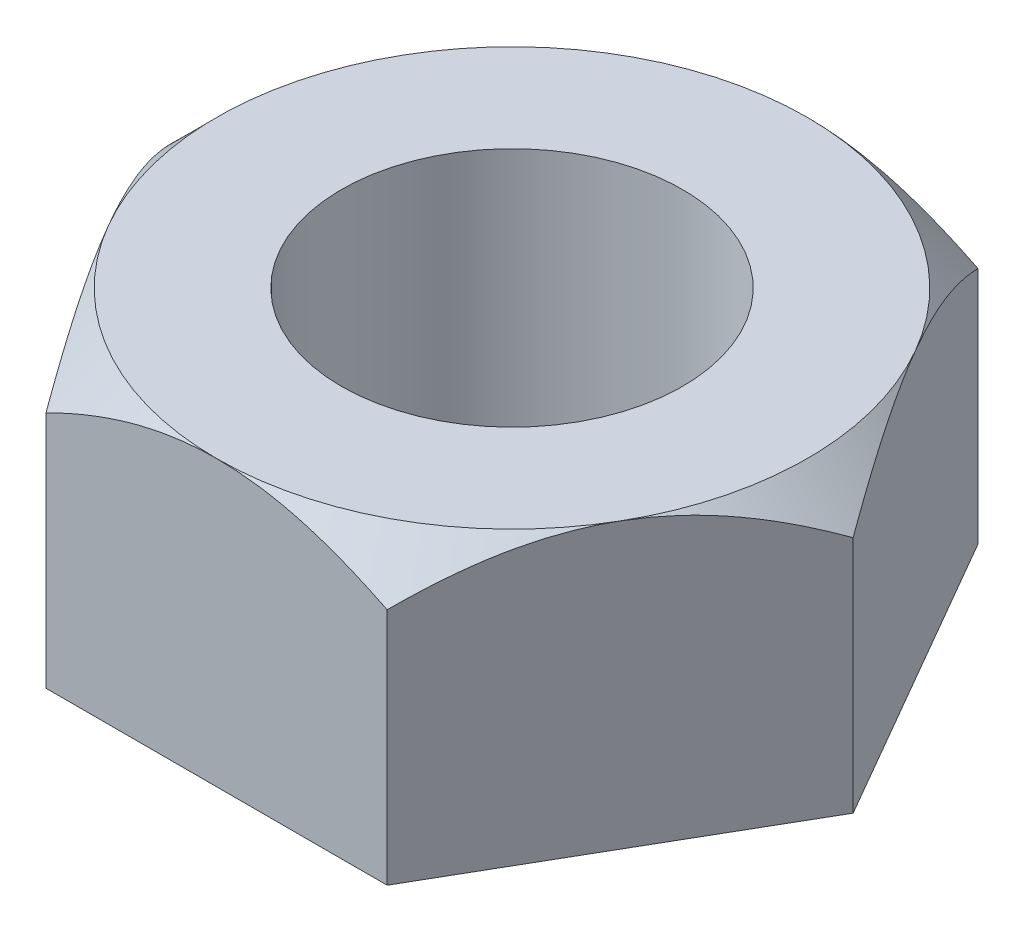
ISO-10303-21;
HEADER;
FILE_DESCRIPTION(('STEP AP214'),'2;1');
FILE_NAME('part.step','',(''),(''),'','','');
FILE_SCHEMA(('AUTOMOTIVE_DESIGN { 1 0 10303 214 1 1 1 1 }'));
ENDSEC;
DATA;
#1=APPLICATION_CONTEXT('core data for automotive mechanical design processes');
#2=APPLICATION_PROTOCOL_DEFINITION('international standard','automotive_design',2000,#1);
#3=PRODUCT_CONTEXT('',#1,'mechanical');
#4=PRODUCT('Part','Part','',(#3));
#5=PRODUCT_RELATED_PRODUCT_CATEGORY('part','',(#4));
#6=PRODUCT_DEFINITION_FORMATION('','',#4);
#7=PRODUCT_DEFINITION_CONTEXT('part definition',#1,'design');
#8=PRODUCT_DEFINITION('design','',#6,#7);
#9=PRODUCT_DEFINITION_SHAPE('','',#8);
#10=(LENGTH_UNIT() NAMED_UNIT(*) SI_UNIT(.MILLI.,.METRE.));
#11=(NAMED_UNIT(*) PLANE_ANGLE_UNIT() SI_UNIT($,.RADIAN.));
#12=(NAMED_UNIT(*) SI_UNIT($,.STERADIAN.) SOLID_ANGLE_UNIT());
#13=UNCERTAINTY_MEASURE_WITH_UNIT(LENGTH_MEASURE(1.E-05),#10,'distance_accuracy_value','');
#14=(GEOMETRIC_REPRESENTATION_CONTEXT(3) GLOBAL_UNCERTAINTY_ASSIGNED_CONTEXT((#13)) GLOBAL_UNIT_ASSIGNED_CONTEXT((#10,
#11,#12)) REPRESENTATION_CONTEXT('',''));
#15=CARTESIAN_POINT('',(0.,0.,0.));
#16=DIRECTION('',(0.,0.,1.));
#17=DIRECTION('',(1.,0.,0.));
#18=AXIS2_PLACEMENT_3D('',#15,#16,#17);
#19=CARTESIAN_POINT('',(-6.,10.,10.3923048454133));
#20=DIRECTION('',(0.,0.,-1.));
#21=DIRECTION('',(-1.,0.,0.));
#22=AXIS2_PLACEMENT_3D('',#19,#20,#21);
#23=PLANE('',#22);
#24=CARTESIAN_POINT('',(-21.6206993518133,-3.596330806943,10.3923048454133));
#25=CARTESIAN_POINT('',(-21.3055514126179,-3.3122960604371,10.3923048454133));
#26=CARTESIAN_POINT('',(-20.9898299589717,-3.02889886599414,10.3923048454133));
#27=CARTESIAN_POINT('',(-20.3570839472921,-2.46356232683649,10.3923048454133));
#28=CARTESIAN_POINT('',(-20.0400593873951,-2.18162298420794,10.3923048454133));
#29=CARTESIAN_POINT('',(-19.0866059232702,-1.33809688267694,10.3923048454133));
#30=CARTESIAN_POINT('',(-18.4479878344888,-0.778974225031821,10.3923048454133));
#31=CARTESIAN_POINT('',(-17.4811694968122,0.0560144141050043,10.3923048454133));
#32=CARTESIAN_POINT('',(-17.155762278147,0.335116547171424,10.3923048454133));
#33=CARTESIAN_POINT('',(-16.5027541968676,0.890730128355099,10.3923048454133));
#34=CARTESIAN_POINT('',(-16.1751533854532,1.16724163658034,10.3923048454133));
#35=CARTESIAN_POINT('',(-15.5174864907664,1.71719097919003,10.3923048454133));
#36=CARTESIAN_POINT('',(-15.187420891801,1.99062939226446,10.3923048454133));
#37=CARTESIAN_POINT('',(-14.5243374489299,2.53396673416056,10.3923048454133));
#38=CARTESIAN_POINT('',(-14.1913193517913,2.80386535435777,10.3923048454133));
#39=CARTESIAN_POINT('',(-13.5542248987635,3.31354301426288,10.3923048454133));
#40=CARTESIAN_POINT('',(-13.2504611992028,3.55371250124612,10.3923048454133));
#41=CARTESIAN_POINT('',(-12.6397408542536,4.02995499860667,10.3923048454133));
#42=CARTESIAN_POINT('',(-12.3327842505221,4.26602806232206,10.3923048454133));
#43=CARTESIAN_POINT('',(-11.7152096179151,4.73327041249862,10.3923048454133));
#44=CARTESIAN_POINT('',(-11.4045920105797,4.9644402551152,10.3923048454133));
#45=CARTESIAN_POINT('',(-10.77907899405,5.42090531236507,10.3923048454133));
#46=CARTESIAN_POINT('',(-10.4641837555985,5.64620076043456,10.3923048454133));
#47=CARTESIAN_POINT('',(-9.83007578699629,6.08919258607606,10.3923048454133));
#48=CARTESIAN_POINT('',(-9.51087368019942,6.30690412570485,10.3923048454133));
#49=CARTESIAN_POINT('',(-8.86666135316096,6.73362882974555,10.3923048454133));
#50=CARTESIAN_POINT('',(-8.54165082085976,6.9426415247888,10.3923048454133));
#51=CARTESIAN_POINT('',(-7.88515221894587,7.34970782275022,10.3923048454133));
#52=CARTESIAN_POINT('',(-7.55366935481359,7.54776977846495,10.3923048454133));
#53=CARTESIAN_POINT('',(-6.88301435919936,7.93036175659987,10.3923048454133));
#54=CARTESIAN_POINT('',(-6.54384352998889,8.114894048726,10.3923048454133));
#55=CARTESIAN_POINT('',(-5.87757356544897,8.45626320037056,10.3923048454133));
#56=CARTESIAN_POINT('',(-5.55099295818714,8.61410155703159,10.3923048454133));
#57=CARTESIAN_POINT('',(-5.05483096651693,8.83680767212428,10.3923048454133));
#58=CARTESIAN_POINT('',(-4.88839449632592,8.90870138002609,10.3923048454133));
#59=CARTESIAN_POINT('',(-4.55330416372106,9.04729307515487,10.3923048454133));
#60=CARTESIAN_POINT('',(-4.38464952088745,9.11398917327526,10.3923048454133));
#61=CARTESIAN_POINT('',(-3.87627471703024,9.3050580690559,10.3923048454133));
#62=CARTESIAN_POINT('',(-3.53324315311512,9.42082191235406,10.3923048454133));
#63=CARTESIAN_POINT('',(-2.83901608514014,9.62429174950344,10.3923048454133));
#64=CARTESIAN_POINT('',(-2.48782466676752,9.712011473751,10.3923048454133));
#65=CARTESIAN_POINT('',(-1.83410167957487,9.84346469092425,10.3923048454133));
#66=CARTESIAN_POINT('',(-1.532527448349,9.89192574685305,10.3923048454133));
#67=CARTESIAN_POINT('',(-0.92635308742365,9.96313322104827,10.3923048454133));
#68=CARTESIAN_POINT('',(-0.62175342865318,9.98588357999496,10.3923048454133));
#69=CARTESIAN_POINT('',(-0.0120669556095173,10.0044545916522,10.3923048454133));
#70=CARTESIAN_POINT('',(0.293018909048942,10.000305878249,10.3923048454133));
#71=CARTESIAN_POINT('',(0.901668344868203,9.96538747166634,10.3923048454133));
#72=CARTESIAN_POINT('',(1.20523169297935,9.93461398627781,10.3923048454133));
#73=CARTESIAN_POINT('',(1.88652949323463,9.83683042574832,10.3923048454133));
#74=CARTESIAN_POINT('',(2.26321906330949,9.76252598791442,10.3923048454133));
#75=CARTESIAN_POINT('',(3.00808460636821,9.57944762224546,10.3923048454133));
#76=CARTESIAN_POINT('',(3.37625684553137,9.47065887332788,10.3923048454133));
#77=CARTESIAN_POINT('',(4.10474857763028,9.22401107197817,10.3923048454133));
#78=CARTESIAN_POINT('',(4.46501735067411,9.08600396250787,10.3923048454133));
#79=CARTESIAN_POINT('',(4.9979788556195,8.86174352448241,10.3923048454133));
#80=CARTESIAN_POINT('',(5.17438587361458,8.78411834986138,10.3923048454133));
#81=CARTESIAN_POINT('',(5.52484590698173,8.6237173827543,10.3923048454133));
#82=CARTESIAN_POINT('',(5.69889893597159,8.54094162007983,10.3923048454133));
#83=CARTESIAN_POINT('',(6.15121807751195,8.31843775144226,10.3923048454133));
#84=CARTESIAN_POINT('',(6.42767062753615,8.17502179315701,10.3923048454133));
#85=CARTESIAN_POINT('',(6.97522748516027,7.87827823116683,10.3923048454133));
#86=CARTESIAN_POINT('',(7.24633088988748,7.7249489725796,10.3923048454133));
#87=CARTESIAN_POINT('',(7.78387778962265,7.40995949321741,10.3923048454133));
#88=CARTESIAN_POINT('',(8.05031810084943,7.24829385675954,10.3923048454133));
#89=CARTESIAN_POINT('',(8.57887190669922,6.91808974168155,10.3923048454133));
#90=CARTESIAN_POINT('',(8.84098562287998,6.74955161653359,10.3923048454133));
#91=CARTESIAN_POINT('',(9.36204762535117,6.40626115586318,10.3923048454133));
#92=CARTESIAN_POINT('',(9.62098630485496,6.23149427224553,10.3923048454133));
#93=CARTESIAN_POINT('',(10.1354737518374,5.87703280649236,10.3923048454133));
#94=CARTESIAN_POINT('',(10.3910223941222,5.69733804311815,10.3923048454133));
#95=CARTESIAN_POINT('',(11.1530005881035,5.15212391316027,10.3923048454133));
#96=CARTESIAN_POINT('',(11.6549546595064,4.7803464788793,10.3923048454133));
#97=CARTESIAN_POINT('',(12.6516719131614,4.02282960092673,10.3923048454133));
#98=CARTESIAN_POINT('',(13.146393216593,3.63703544381726,10.3923048454133));
#99=CARTESIAN_POINT('',(14.1283558734258,2.8560018432547,10.3923048454133));
#100=CARTESIAN_POINT('',(14.6155967522649,2.46076180458316,10.3923048454133));
#101=CARTESIAN_POINT('',(15.5834024343999,1.66352121613933,10.3923048454133));
#102=CARTESIAN_POINT('',(16.0639753221122,1.26153045461263,10.3923048454133));
#103=CARTESIAN_POINT('',(17.0202286237539,0.451803972584521,10.3923048454133));
#104=CARTESIAN_POINT('',(17.4959091504046,0.0440683849607594,10.3923048454133));
#105=CARTESIAN_POINT('',(18.5857834106937,-0.899383889295671,10.3923048454133));
#106=CARTESIAN_POINT('',(19.1985933109595,-1.43669817946351,10.3923048454133));
#107=CARTESIAN_POINT('',(20.1119913713059,-2.24555025523196,10.3923048454133));
#108=CARTESIAN_POINT('',(20.4145843309025,-2.51483159840266,10.3923048454133));
#109=CARTESIAN_POINT('',(21.0185255042956,-3.05465875172758,10.3923048454133));
#110=CARTESIAN_POINT('',(21.3198739674337,-3.32520428287831,10.3923048454133));
#111=CARTESIAN_POINT('',(21.6206993518133,-3.596330806943,10.3923048454133));
#112=B_SPLINE_CURVE_WITH_KNOTS('',3,(#24,#25,#26,#27,#28,#29,#30,#31,#32,#33,#34,#35,#36,#37,
#38,#39,#40,#41,#42,#43,#44,#45,#46,#47,#48,#49,#50,#51,#52,#53,#54,#55,#56,#57,#58,#59,#60,#61,
#62,#63,#64,#65,#66,#67,#68,#69,#70,#71,#72,#73,#74,#75,#76,#77,#78,#79,#80,#81,#82,#83,#84,#85,
#86,#87,#88,#89,#90,#91,#92,#93,#94,#95,#96,#97,#98,#99,#100,#101,#102,#103,#104,#105,#106,#107,
#108,#109,#110,#111),.UNSPECIFIED.,.F.,.F.,(4,2,2,2,2,2,2,2,2,2,2,2,2,2,2,2,2,2,2,2,2,2,2,2,2,2,
2,2,2,2,2,2,2,2,2,2,2,2,2,2,2,2,2,4),(0.,1.27276775466827,2.54553733011866,5.09184700659243,
6.37795130686239,7.66402569251973,8.94985369884594,10.2357930774019,11.3974798330945,
12.5591514515108,13.7206905931806,14.8821835071429,16.0412027596678,17.2002844692094,
18.3584695209899,19.5164598315717,20.604096177326,21.1479183662783,21.6919372980782,
22.7770118849817,23.8615544030578,24.7768783846365,25.6920620554116,26.6062036566352,
27.5204754819565,28.6703479249883,29.8207152456636,30.9770576048754,31.5551849882646,
32.1333090257656,33.0673651644254,34.0015776348918,34.9364048511609,35.8711840470332,
36.8083116692343,37.745473803676,39.6191051770633,41.5010644716399,43.3831426694556,
45.2626941975387,47.1422023227891,49.5871775634721,50.8023598643285,52.0172855745421),.UNSPECIFIED.);
#113=CARTESIAN_POINT('',(-6.,8.39230484541327,10.3923048454133));
#114=VERTEX_POINT('',#113);
#115=CARTESIAN_POINT('',(0.,10.,10.3923048454133));
#116=VERTEX_POINT('',#115);
#117=EDGE_CURVE('E209',#114,#116,#112,.T.);
#118=ORIENTED_EDGE('',*,*,#117,.F.);
#119=DIRECTION('',(0.,-1.,0.));
#120=VECTOR('',#119,1.);
#121=CARTESIAN_POINT('',(-6.,10.,10.3923048454133));
#122=LINE('',#121,#120);
#123=CARTESIAN_POINT('',(-6.,0.,10.3923048454133));
#124=VERTEX_POINT('',#123);
#125=EDGE_CURVE('E212',#114,#124,#122,.T.);
#126=ORIENTED_EDGE('',*,*,#125,.T.);
#127=DIRECTION('',(1.,0.,0.));
#128=VECTOR('',#127,1.);
#129=CARTESIAN_POINT('',(-6.,0.,10.3923048454133));
#130=LINE('',#129,#128);
#131=CARTESIAN_POINT('',(6.,0.,10.3923048454133));
#132=VERTEX_POINT('',#131);
#133=EDGE_CURVE('E214',#124,#132,#130,.T.);
#134=ORIENTED_EDGE('',*,*,#133,.T.);
#135=DIRECTION('',(0.,-1.,0.));
#136=VECTOR('',#135,1.);
#137=CARTESIAN_POINT('',(6.,10.,10.3923048454133));
#138=LINE('',#137,#136);
#139=CARTESIAN_POINT('',(6.,8.39230484541327,10.3923048454133));
#140=VERTEX_POINT('',#139);
#141=EDGE_CURVE('E233',#140,#132,#138,.T.);
#142=ORIENTED_EDGE('',*,*,#141,.F.);
#143=EDGE_CURVE('E114',#116,#140,#112,.T.);
#144=ORIENTED_EDGE('',*,*,#143,.F.);
#145=EDGE_LOOP('',(#118,#126,#134,#142,#144));
#146=FACE_BOUND('',#145,.T.);
#147=ADVANCED_FACE('F38',(#146),#23,.F.);
#148=CARTESIAN_POINT('',(6.,10.,10.3923048454133));
#149=DIRECTION('',(-0.866025403784439,0.,-0.5));
#150=DIRECTION('',(-0.5,0.,0.866025403784439));
#151=AXIS2_PLACEMENT_3D('',#148,#149,#150);
#152=PLANE('',#151);
#153=CARTESIAN_POINT('',(5.99988452994617,8.39218937369278,10.3925048454133));
#154=CARTESIAN_POINT('',(6.1030381594071,8.4953281696419,10.2138375182018));
#155=CARTESIAN_POINT('',(6.20699964746772,8.59531973140851,10.0337709388503));
#156=CARTESIAN_POINT('',(6.41666408996548,8.7880086633455,9.6706214719036));
#157=CARTESIAN_POINT('',(6.52236795790391,8.88070204993272,9.4875370020777));
#158=CARTESIAN_POINT('',(6.73614147656208,9.05818746620379,9.11727040644898));
#159=CARTESIAN_POINT('',(6.84422120771261,9.14293121606065,8.93007082082787));
#160=CARTESIAN_POINT('',(7.06215583727054,9.30267680526308,8.55259696970483));
#161=CARTESIAN_POINT('',(7.17201046138372,9.37768013401625,8.36232317929443));
#162=CARTESIAN_POINT('',(7.39172859565888,9.5155717685406,7.98176020738561));
#163=CARTESIAN_POINT('',(7.50156510516717,9.57863117888927,7.79151779239123));
#164=CARTESIAN_POINT('',(7.72277783197739,9.69279444914292,7.40836611027507));
#165=CARTESIAN_POINT('',(7.8341538821485,9.74389959616047,7.21545713263237));
#166=CARTESIAN_POINT('',(8.05796930351608,9.83286771805832,6.82779745130629));
#167=CARTESIAN_POINT('',(8.17040568583668,9.87076049950764,6.63305192450777));
#168=CARTESIAN_POINT('',(8.39622238331246,9.93247124852732,6.24192593128229));
#169=CARTESIAN_POINT('',(8.50960255484698,9.95629131928772,6.04554571361363));
#170=CARTESIAN_POINT('',(8.78590060608536,9.99623087577283,5.56698345083649));
#171=CARTESIAN_POINT('',(8.94911712583534,10.0046121370882,5.28428414599495));
#172=CARTESIAN_POINT('',(9.27525497510895,9.99054418700371,4.71939682078182));
#173=CARTESIAN_POINT('',(9.43817618112011,9.96808416871151,4.4372090143401));
#174=CARTESIAN_POINT('',(9.76248281098389,9.89365937516114,3.8754934541846));
#175=CARTESIAN_POINT('',(9.92386631200424,9.84166160773261,3.59596903091401));
#176=CARTESIAN_POINT('',(10.2438594395474,9.71098774624142,3.0417246759364));
#177=CARTESIAN_POINT('',(10.4024692778025,9.63231369798948,2.76700437749825));
#178=CARTESIAN_POINT('',(10.68402227325,9.47046186580933,2.27934028436002));
#179=CARTESIAN_POINT('',(10.8075890248271,9.39154171858198,2.0653163925023));
#180=CARTESIAN_POINT('',(11.0525044969076,9.22098444399686,1.6411103512991));
#181=CARTESIAN_POINT('',(11.1738531501813,9.12934693190126,1.43092831839898));
#182=CARTESIAN_POINT('',(11.4139502096801,8.93540891686254,1.01506801259922));
#183=CARTESIAN_POINT('',(11.5327054442283,8.83314194803767,0.809377912696873));
#184=CARTESIAN_POINT('',(11.7680170433821,8.61928749062455,0.401806267352167));
#185=CARTESIAN_POINT('',(11.8845747031439,8.50770571656851,0.199922478633452));
#186=CARTESIAN_POINT('',(12.0001154700538,8.39218937369278,-0.000200000000000385));
#187=B_SPLINE_CURVE_WITH_KNOTS('',3,(#153,#154,#155,#156,#157,#158,#159,#160,#161,#162,#163,
#164,#165,#166,#167,#168,#169,#170,#171,#172,#173,#174,#175,#176,#177,#178,#179,#180,#181,#182,
#183,#184,#185,#186),.UNSPECIFIED.,.F.,.F.,(4,2,2,2,2,2,2,2,2,2,2,2,2,2,2,2,4),(0.,
0.691984980547277,1.38434508775371,2.08066945675999,2.77688722513868,3.46221813224621,
4.14747521594488,4.83117622997768,5.51477503789068,6.49287009754457,7.4713079726011,
8.45084086815619,9.43029866007063,10.208220271575,10.9861654226371,11.7617267825501,
12.5368157921917),.UNSPECIFIED.);
#188=CARTESIAN_POINT('',(9.,10.,5.19615242270663));
#189=VERTEX_POINT('',#188);
#190=EDGE_CURVE('E110',#140,#189,#187,.T.);
#191=ORIENTED_EDGE('',*,*,#190,.F.);
#192=ORIENTED_EDGE('',*,*,#141,.T.);
#193=DIRECTION('',(0.5,0.,-0.866025403784439));
#194=VECTOR('',#193,1.);
#195=CARTESIAN_POINT('',(6.,0.,10.3923048454133));
#196=LINE('',#195,#194);
#197=CARTESIAN_POINT('',(12.,0.,0.));
#198=VERTEX_POINT('',#197);
#199=EDGE_CURVE('E258',#132,#198,#196,.T.);
#200=ORIENTED_EDGE('',*,*,#199,.T.);
#201=DIRECTION('',(0.,-1.,0.));
#202=VECTOR('',#201,1.);
#203=CARTESIAN_POINT('',(12.,10.,0.));
#204=LINE('',#203,#202);
#205=CARTESIAN_POINT('',(12.,8.39230484541327,0.));
#206=VERTEX_POINT('',#205);
#207=EDGE_CURVE('E134',#206,#198,#204,.T.);
#208=ORIENTED_EDGE('',*,*,#207,.F.);
#209=EDGE_CURVE('E118',#189,#206,#187,.T.);
#210=ORIENTED_EDGE('',*,*,#209,.F.);
#211=EDGE_LOOP('',(#191,#192,#200,#208,#210));
#212=FACE_BOUND('',#211,.T.);
#213=ADVANCED_FACE('F132',(#212),#152,.F.);
#214=CARTESIAN_POINT('',(12.,10.,0.));
#215=DIRECTION('',(-0.866025403784439,0.,0.5));
#216=DIRECTION('',(0.5,0.,0.866025403784439));
#217=AXIS2_PLACEMENT_3D('',#214,#215,#216);
#218=PLANE('',#217);
#219=CARTESIAN_POINT('',(12.0001154700538,8.39218937369278,0.00019999999999935));
#220=CARTESIAN_POINT('',(11.8969618405929,8.4953281696419,-0.178467327211464));
#221=CARTESIAN_POINT('',(11.7930003525323,8.59531973140851,-0.358533906562927));
#222=CARTESIAN_POINT('',(11.5833359100345,8.7880086633455,-0.721683373509663));
#223=CARTESIAN_POINT('',(11.4776320420961,8.88070204993273,-0.904767843335564));
#224=CARTESIAN_POINT('',(11.2638585234379,9.05818746620379,-1.27503443896429));
#225=CARTESIAN_POINT('',(11.1557787922874,9.14293121606065,-1.4622340245854));
#226=CARTESIAN_POINT('',(10.9378441627295,9.30267680526309,-1.83970787570844));
#227=CARTESIAN_POINT('',(10.8279895386163,9.37768013401625,-2.02998166611883));
#228=CARTESIAN_POINT('',(10.6082714043411,9.5155717685406,-2.41054463802766));
#229=CARTESIAN_POINT('',(10.4984348948328,9.57863117888927,-2.60078705302203));
#230=CARTESIAN_POINT('',(10.2772221680226,9.69279444914292,-2.98393873513819));
#231=CARTESIAN_POINT('',(10.1658461178515,9.74389959616048,-3.17684771278089));
#232=CARTESIAN_POINT('',(9.94203069648393,9.83286771805832,-3.56450739410697));
#233=CARTESIAN_POINT('',(9.82959431416333,9.87076049950763,-3.75925292090549));
#234=CARTESIAN_POINT('',(9.60377761668754,9.93247124852732,-4.15037891413097));
#235=CARTESIAN_POINT('',(9.49039744515302,9.95629131928772,-4.34675913179963));
#236=CARTESIAN_POINT('',(9.21409939391464,9.99623087577284,-4.82532139457677));
#237=CARTESIAN_POINT('',(9.05088287416466,10.0046121370882,-5.10802069941831));
#238=CARTESIAN_POINT('',(8.72474502489105,9.99054418700371,-5.67290802463143));
#239=CARTESIAN_POINT('',(8.5618238188799,9.96808416871151,-5.95509583107315));
#240=CARTESIAN_POINT('',(8.23751718901611,9.89365937516114,-6.51681139122866));
#241=CARTESIAN_POINT('',(8.07613368799577,9.84166160773261,-6.79633581449925));
#242=CARTESIAN_POINT('',(7.75614056045261,9.71098774624142,-7.35058016947686));
#243=CARTESIAN_POINT('',(7.59753072219749,9.63231369798948,-7.625300467915));
#244=CARTESIAN_POINT('',(7.31597772675002,9.47046186580933,-8.11296456105324));
#245=CARTESIAN_POINT('',(7.19241097517295,9.39154171858198,-8.32698845291096));
#246=CARTESIAN_POINT('',(6.94749550309242,9.22098444399686,-8.75119449411416));
#247=CARTESIAN_POINT('',(6.82614684981871,9.12934693190126,-8.96137652701427));
#248=CARTESIAN_POINT('',(6.58604979031994,8.93540891686254,-9.37723683281404));
#249=CARTESIAN_POINT('',(6.46729455577168,8.83314194803767,-9.58292693271639));
#250=CARTESIAN_POINT('',(6.23198295661785,8.61928749062455,-9.9904985780611));
#251=CARTESIAN_POINT('',(6.11542529685608,8.50770571656851,-10.1923823667798));
#252=CARTESIAN_POINT('',(5.99988452994616,8.39218937369278,-10.3925048454133));
#253=B_SPLINE_CURVE_WITH_KNOTS('',3,(#219,#220,#221,#222,#223,#224,#225,#226,#227,#228,#229,
#230,#231,#232,#233,#234,#235,#236,#237,#238,#239,#240,#241,#242,#243,#244,#245,#246,#247,#248,
#249,#250,#251,#252),.UNSPECIFIED.,.F.,.F.,(4,2,2,2,2,2,2,2,2,2,2,2,2,2,2,2,4),(0.,
0.691984980547277,1.38434508775371,2.08066945675999,2.77688722513868,3.46221813224621,
4.14747521594488,4.83117622997767,5.51477503789068,6.49287009754456,7.47130797260109,
8.45084086815619,9.43029866007062,10.208220271575,10.9861654226371,11.7617267825501,
12.5368157921917),.UNSPECIFIED.);
#254=CARTESIAN_POINT('',(9.,10.,-5.19615242270663));
#255=VERTEX_POINT('',#254);
#256=EDGE_CURVE('E123',#206,#255,#253,.T.);
#257=ORIENTED_EDGE('',*,*,#256,.F.);
#258=ORIENTED_EDGE('',*,*,#207,.T.);
#259=DIRECTION('',(-0.5,0.,-0.866025403784439));
#260=VECTOR('',#259,1.);
#261=CARTESIAN_POINT('',(12.,0.,0.));
#262=LINE('',#261,#260);
#263=CARTESIAN_POINT('',(6.,0.,-10.3923048454133));
#264=VERTEX_POINT('',#263);
#265=EDGE_CURVE('E259',#198,#264,#262,.T.);
#266=ORIENTED_EDGE('',*,*,#265,.T.);
#267=DIRECTION('',(0.,-1.,0.));
#268=VECTOR('',#267,1.);
#269=CARTESIAN_POINT('',(6.,10.,-10.3923048454133));
#270=LINE('',#269,#268);
#271=CARTESIAN_POINT('',(6.,8.39230484541327,-10.3923048454133));
#272=VERTEX_POINT('',#271);
#273=EDGE_CURVE('E231',#272,#264,#270,.T.);
#274=ORIENTED_EDGE('',*,*,#273,.F.);
#275=EDGE_CURVE('E135',#255,#272,#253,.T.);
#276=ORIENTED_EDGE('',*,*,#275,.F.);
#277=EDGE_LOOP('',(#257,#258,#266,#274,#276));
#278=FACE_BOUND('',#277,.T.);
#279=ADVANCED_FACE('F195',(#278),#218,.F.);
#280=CARTESIAN_POINT('',(6.,10.,-10.3923048454133));
#281=DIRECTION('',(0.,0.,1.));
#282=DIRECTION('',(1.,0.,0.));
#283=AXIS2_PLACEMENT_3D('',#280,#281,#282);
#284=PLANE('',#283);
#285=CARTESIAN_POINT('',(21.6206993518133,-3.596330806943,-10.3923048454133));
#286=CARTESIAN_POINT('',(21.3055514126179,-3.3122960604371,-10.3923048454133));
#287=CARTESIAN_POINT('',(20.9898299589717,-3.02889886599414,-10.3923048454133));
#288=CARTESIAN_POINT('',(20.3570839472921,-2.46356232683649,-10.3923048454133));
#289=CARTESIAN_POINT('',(20.0400593873951,-2.18162298420794,-10.3923048454133));
#290=CARTESIAN_POINT('',(19.0866059232702,-1.33809688267694,-10.3923048454133));
#291=CARTESIAN_POINT('',(18.4479878344888,-0.778974225031822,-10.3923048454133));
#292=CARTESIAN_POINT('',(17.4811694968122,0.0560144141050044,-10.3923048454133));
#293=CARTESIAN_POINT('',(17.155762278147,0.335116547171425,-10.3923048454133));
#294=CARTESIAN_POINT('',(16.5027541968676,0.890730128355101,-10.3923048454133));
#295=CARTESIAN_POINT('',(16.1751533854532,1.16724163658034,-10.3923048454133));
#296=CARTESIAN_POINT('',(15.5174864907664,1.71719097919003,-10.3923048454133));
#297=CARTESIAN_POINT('',(15.187420891801,1.99062939226445,-10.3923048454133));
#298=CARTESIAN_POINT('',(14.5243374489299,2.53396673416056,-10.3923048454133));
#299=CARTESIAN_POINT('',(14.1913193517913,2.80386535435777,-10.3923048454133));
#300=CARTESIAN_POINT('',(13.5542248987635,3.31354301426288,-10.3923048454133));
#301=CARTESIAN_POINT('',(13.2504611992028,3.55371250124611,-10.3923048454133));
#302=CARTESIAN_POINT('',(12.6397408542536,4.02995499860666,-10.3923048454133));
#303=CARTESIAN_POINT('',(12.3327842505221,4.26602806232205,-10.3923048454133));
#304=CARTESIAN_POINT('',(11.7152096179151,4.73327041249861,-10.3923048454133));
#305=CARTESIAN_POINT('',(11.4045920105797,4.96444025511519,-10.3923048454133));
#306=CARTESIAN_POINT('',(10.77907899405,5.42090531236507,-10.3923048454133));
#307=CARTESIAN_POINT('',(10.4641837555986,5.64620076043456,-10.3923048454133));
#308=CARTESIAN_POINT('',(9.8300757869963,6.08919258607605,-10.3923048454133));
#309=CARTESIAN_POINT('',(9.51087368019943,6.30690412570484,-10.3923048454133));
#310=CARTESIAN_POINT('',(8.86666135316098,6.73362882974554,-10.3923048454133));
#311=CARTESIAN_POINT('',(8.54165082085978,6.94264152478879,-10.3923048454133));
#312=CARTESIAN_POINT('',(7.88515221894589,7.34970782275022,-10.3923048454133));
#313=CARTESIAN_POINT('',(7.55366935481362,7.54776977846494,-10.3923048454133));
#314=CARTESIAN_POINT('',(6.88301435919938,7.93036175659986,-10.3923048454133));
#315=CARTESIAN_POINT('',(6.54384352998891,8.11489404872599,-10.3923048454133));
#316=CARTESIAN_POINT('',(5.877573565449,8.45626320037054,-10.3923048454133));
#317=CARTESIAN_POINT('',(5.55099295818717,8.61410155703158,-10.3923048454133));
#318=CARTESIAN_POINT('',(5.05483096651696,8.83680767212427,-10.3923048454133));
#319=CARTESIAN_POINT('',(4.88839449632595,8.90870138002608,-10.3923048454133));
#320=CARTESIAN_POINT('',(4.55330416372108,9.04729307515486,-10.3923048454133));
#321=CARTESIAN_POINT('',(4.38464952088748,9.11398917327525,-10.3923048454133));
#322=CARTESIAN_POINT('',(3.87627471703026,9.30505806905589,-10.3923048454133));
#323=CARTESIAN_POINT('',(3.53324315311515,9.42082191235405,-10.3923048454133));
#324=CARTESIAN_POINT('',(2.83901608514017,9.62429174950344,-10.3923048454133));
#325=CARTESIAN_POINT('',(2.48782466676755,9.712011473751,-10.3923048454133));
#326=CARTESIAN_POINT('',(1.8341016795749,9.84346469092424,-10.3923048454133));
#327=CARTESIAN_POINT('',(1.53252744834903,9.89192574685304,-10.3923048454133));
#328=CARTESIAN_POINT('',(0.926353087423679,9.96313322104827,-10.3923048454133));
#329=CARTESIAN_POINT('',(0.621753428653209,9.98588357999496,-10.3923048454133));
#330=CARTESIAN_POINT('',(0.012066955609546,10.0044545916522,-10.3923048454133));
#331=CARTESIAN_POINT('',(-0.293018909048914,10.000305878249,-10.3923048454133));
#332=CARTESIAN_POINT('',(-0.901668344868174,9.96538747166635,-10.3923048454133));
#333=CARTESIAN_POINT('',(-1.20523169297932,9.93461398627781,-10.3923048454133));
#334=CARTESIAN_POINT('',(-1.8865294932346,9.83683042574832,-10.3923048454133));
#335=CARTESIAN_POINT('',(-2.26321906330946,9.76252598791442,-10.3923048454133));
#336=CARTESIAN_POINT('',(-3.00808460636818,9.57944762224547,-10.3923048454133));
#337=CARTESIAN_POINT('',(-3.37625684553134,9.47065887332789,-10.3923048454133));
#338=CARTESIAN_POINT('',(-4.10474857763024,9.22401107197819,-10.3923048454133));
#339=CARTESIAN_POINT('',(-4.46501735067407,9.08600396250789,-10.3923048454133));
#340=CARTESIAN_POINT('',(-4.99797885561946,8.86174352448243,-10.3923048454133));
#341=CARTESIAN_POINT('',(-5.17438587361454,8.7841183498614,-10.3923048454133));
#342=CARTESIAN_POINT('',(-5.52484590698169,8.62371738275432,-10.3923048454133));
#343=CARTESIAN_POINT('',(-5.69889893597155,8.54094162007985,-10.3923048454133));
#344=CARTESIAN_POINT('',(-6.1512180775119,8.31843775144228,-10.3923048454133));
#345=CARTESIAN_POINT('',(-6.4276706275361,8.17502179315704,-10.3923048454133));
#346=CARTESIAN_POINT('',(-6.97522748516021,7.87827823116686,-10.3923048454133));
#347=CARTESIAN_POINT('',(-7.24633088988743,7.72494897257964,-10.3923048454133));
#348=CARTESIAN_POINT('',(-7.78387778962259,7.40995949321745,-10.3923048454133));
#349=CARTESIAN_POINT('',(-8.05031810084937,7.24829385675958,-10.3923048454133));
#350=CARTESIAN_POINT('',(-8.57887190669915,6.91808974168159,-10.3923048454133));
#351=CARTESIAN_POINT('',(-8.84098562287991,6.74955161653363,-10.3923048454133));
#352=CARTESIAN_POINT('',(-9.3620476253511,6.40626115586322,-10.3923048454133));
#353=CARTESIAN_POINT('',(-9.62098630485489,6.23149427224557,-10.3923048454133));
#354=CARTESIAN_POINT('',(-10.1354737518373,5.87703280649241,-10.3923048454133));
#355=CARTESIAN_POINT('',(-10.3910223941221,5.6973380431182,-10.3923048454133));
#356=CARTESIAN_POINT('',(-11.1530005881034,5.15212391316033,-10.3923048454133));
#357=CARTESIAN_POINT('',(-11.6549546595064,4.78034647887936,-10.3923048454133));
#358=CARTESIAN_POINT('',(-12.6516719131613,4.0228296009268,-10.3923048454133));
#359=CARTESIAN_POINT('',(-13.1463932165929,3.63703544381734,-10.3923048454133));
#360=CARTESIAN_POINT('',(-14.1283558734257,2.85600184325479,-10.3923048454133));
#361=CARTESIAN_POINT('',(-14.6155967522648,2.46076180458325,-10.3923048454133));
#362=CARTESIAN_POINT('',(-15.5834024343997,1.66352121613942,-10.3923048454133));
#363=CARTESIAN_POINT('',(-16.0639753221121,1.26153045461274,-10.3923048454133));
#364=CARTESIAN_POINT('',(-17.0202286237538,0.451803972584636,-10.3923048454133));
#365=CARTESIAN_POINT('',(-17.4959091504045,0.0440683849608765,-10.3923048454133));
#366=CARTESIAN_POINT('',(-18.5857834106936,-0.899383889295572,-10.3923048454133));
#367=CARTESIAN_POINT('',(-19.1985933109594,-1.43669817946343,-10.3923048454133));
#368=CARTESIAN_POINT('',(-20.1119913713058,-2.24555025523191,-10.3923048454133));
#369=CARTESIAN_POINT('',(-20.4145843309024,-2.51483159840262,-10.3923048454133));
#370=CARTESIAN_POINT('',(-21.0185255042955,-3.05465875172756,-10.3923048454133));
#371=CARTESIAN_POINT('',(-21.3198739674337,-3.32520428287829,-10.3923048454133));
#372=CARTESIAN_POINT('',(-21.6206993518133,-3.59633080694299,-10.3923048454133));
#373=B_SPLINE_CURVE_WITH_KNOTS('',3,(#285,#286,#287,#288,#289,#290,#291,#292,#293,#294,#295,
#296,#297,#298,#299,#300,#301,#302,#303,#304,#305,#306,#307,#308,#309,#310,#311,#312,#313,#314,
#315,#316,#317,#318,#319,#320,#321,#322,#323,#324,#325,#326,#327,#328,#329,#330,#331,#332,#333,
#334,#335,#336,#337,#338,#339,#340,#341,#342,#343,#344,#345,#346,#347,#348,#349,#350,#351,#352,
#353,#354,#355,#356,#357,#358,#359,#360,#361,#362,#363,#364,#365,#366,#367,#368,#369,#370,#371,
#372),.UNSPECIFIED.,.F.,.F.,(4,2,2,2,2,2,2,2,2,2,2,2,2,2,2,2,2,2,2,2,2,2,2,2,2,2,2,2,2,2,2,2,2,
2,2,2,2,2,2,2,2,2,2,4),(0.,1.27276775466827,2.54553733011866,5.09184700659242,6.37795130686239,
7.66402569251973,8.94985369884593,10.2357930774019,11.3974798330945,12.5591514515107,
13.7206905931806,14.8821835071429,16.0412027596678,17.2002844692093,18.3584695209899,
19.5164598315717,20.604096177326,21.1479183662782,21.6919372980781,22.7770118849817,
23.8615544030577,24.7768783846365,25.6920620554116,26.6062036566352,27.5204754819565,
28.6703479249882,29.8207152456636,30.9770576048753,31.5551849882645,32.1333090257656,
33.0673651644253,34.0015776348918,34.9364048511608,35.8711840470331,36.8083116692343,
37.7454738036759,39.6191051770632,41.5010644716398,43.3831426694555,45.2626941975386,
47.1422023227889,49.5871775634721,50.8023598643284,52.0172855745421),.UNSPECIFIED.);
#374=CARTESIAN_POINT('',(0.,10.,-10.3923048454133));
#375=VERTEX_POINT('',#374);
#376=EDGE_CURVE('E189',#272,#375,#373,.T.);
#377=ORIENTED_EDGE('',*,*,#376,.F.);
#378=ORIENTED_EDGE('',*,*,#273,.T.);
#379=DIRECTION('',(-1.,0.,0.));
#380=VECTOR('',#379,1.);
#381=CARTESIAN_POINT('',(6.,0.,-10.3923048454133));
#382=LINE('',#381,#380);
#383=CARTESIAN_POINT('',(-6.,0.,-10.3923048454133));
#384=VERTEX_POINT('',#383);
#385=EDGE_CURVE('E256',#264,#384,#382,.T.);
#386=ORIENTED_EDGE('',*,*,#385,.T.);
#387=DIRECTION('',(0.,-1.,0.));
#388=VECTOR('',#387,1.);
#389=CARTESIAN_POINT('',(-6.,10.,-10.3923048454133));
#390=LINE('',#389,#388);
#391=CARTESIAN_POINT('',(-6.,8.39230484541327,-10.3923048454133));
#392=VERTEX_POINT('',#391);
#393=EDGE_CURVE('E224',#392,#384,#390,.T.);
#394=ORIENTED_EDGE('',*,*,#393,.F.);
#395=EDGE_CURVE('E183',#375,#392,#373,.T.);
#396=ORIENTED_EDGE('',*,*,#395,.F.);
#397=EDGE_LOOP('',(#377,#378,#386,#394,#396));
#398=FACE_BOUND('',#397,.T.);
#399=ADVANCED_FACE('F191',(#398),#284,.F.);
#400=CARTESIAN_POINT('',(-6.,10.,-10.3923048454133));
#401=DIRECTION('',(0.866025403784439,0.,0.5));
#402=DIRECTION('',(0.5,0.,-0.866025403784439));
#403=AXIS2_PLACEMENT_3D('',#400,#401,#402);
#404=PLANE('',#403);
#405=CARTESIAN_POINT('',(-5.99988452994616,8.39218937369278,-10.3925048454133));
#406=CARTESIAN_POINT('',(-6.10303815940709,8.4953281696419,-10.2138375182018));
#407=CARTESIAN_POINT('',(-6.20699964746771,8.59531973140851,-10.0337709388503));
#408=CARTESIAN_POINT('',(-6.41666408996548,8.7880086633455,-9.6706214719036));
#409=CARTESIAN_POINT('',(-6.5223679579039,8.88070204993273,-9.4875370020777));
#410=CARTESIAN_POINT('',(-6.73614147656207,9.05818746620379,-9.11727040644898));
#411=CARTESIAN_POINT('',(-6.84422120771261,9.14293121606065,-8.93007082082787));
#412=CARTESIAN_POINT('',(-7.06215583727054,9.30267680526308,-8.55259696970483));
#413=CARTESIAN_POINT('',(-7.17201046138371,9.37768013401625,-8.36232317929444));
#414=CARTESIAN_POINT('',(-7.39172859565888,9.5155717685406,-7.98176020738561));
#415=CARTESIAN_POINT('',(-7.50156510516716,9.57863117888927,-7.79151779239124));
#416=CARTESIAN_POINT('',(-7.72277783197738,9.69279444914292,-7.40836611027508));
#417=CARTESIAN_POINT('',(-7.83415388214849,9.74389959616048,-7.21545713263237));
#418=CARTESIAN_POINT('',(-8.05796930351607,9.83286771805832,-6.82779745130629));
#419=CARTESIAN_POINT('',(-8.17040568583667,9.87076049950763,-6.63305192450778));
#420=CARTESIAN_POINT('',(-8.39622238331246,9.93247124852732,-6.2419259312823));
#421=CARTESIAN_POINT('',(-8.50960255484698,9.95629131928772,-6.04554571361364));
#422=CARTESIAN_POINT('',(-8.78590060608536,9.99623087577283,-5.5669834508365));
#423=CARTESIAN_POINT('',(-8.94911712583534,10.0046121370882,-5.28428414599496));
#424=CARTESIAN_POINT('',(-9.27525497510895,9.99054418700371,-4.71939682078183));
#425=CARTESIAN_POINT('',(-9.4381761811201,9.96808416871151,-4.43720901434011));
#426=CARTESIAN_POINT('',(-9.76248281098389,9.89365937516114,-3.8754934541846));
#427=CARTESIAN_POINT('',(-9.92386631200423,9.84166160773261,-3.59596903091402));
#428=CARTESIAN_POINT('',(-10.2438594395474,9.71098774624142,-3.0417246759364));
#429=CARTESIAN_POINT('',(-10.4024692778025,9.63231369798948,-2.76700437749826));
#430=CARTESIAN_POINT('',(-10.68402227325,9.47046186580933,-2.27934028436003));
#431=CARTESIAN_POINT('',(-10.807589024827,9.39154171858198,-2.06531639250231));
#432=CARTESIAN_POINT('',(-11.0525044969076,9.22098444399686,-1.6411103512991));
#433=CARTESIAN_POINT('',(-11.1738531501813,9.12934693190126,-1.43092831839899));
#434=CARTESIAN_POINT('',(-11.4139502096801,8.93540891686254,-1.01506801259923));
#435=CARTESIAN_POINT('',(-11.5327054442283,8.83314194803767,-0.809377912696879));
#436=CARTESIAN_POINT('',(-11.7680170433821,8.61928749062455,-0.40180626735217));
#437=CARTESIAN_POINT('',(-11.8845747031439,8.50770571656851,-0.199922478633454));
#438=CARTESIAN_POINT('',(-12.0001154700538,8.39218937369278,0.000199999999998548));
#439=B_SPLINE_CURVE_WITH_KNOTS('',3,(#405,#406,#407,#408,#409,#410,#411,#412,#413,#414,#415,
#416,#417,#418,#419,#420,#421,#422,#423,#424,#425,#426,#427,#428,#429,#430,#431,#432,#433,#434,
#435,#436,#437,#438),.UNSPECIFIED.,.F.,.F.,(4,2,2,2,2,2,2,2,2,2,2,2,2,2,2,2,4),(0.,
0.691984980547275,1.38434508775371,2.08066945675998,2.77688722513868,3.46221813224621,
4.14747521594488,4.83117622997767,5.51477503789068,6.49287009754456,7.47130797260109,
8.45084086815619,9.43029866007062,10.208220271575,10.9861654226371,11.7617267825501,
12.5368157921917),.UNSPECIFIED.);
#440=CARTESIAN_POINT('',(-9.,10.,-5.19615242270663));
#441=VERTEX_POINT('',#440);
#442=EDGE_CURVE('E190',#392,#441,#439,.T.);
#443=ORIENTED_EDGE('',*,*,#442,.F.);
#444=ORIENTED_EDGE('',*,*,#393,.T.);
#445=DIRECTION('',(-0.5,0.,0.866025403784439));
#446=VECTOR('',#445,1.);
#447=CARTESIAN_POINT('',(-6.,0.,-10.3923048454133));
#448=LINE('',#447,#446);
#449=CARTESIAN_POINT('',(-12.,0.,0.));
#450=VERTEX_POINT('',#449);
#451=EDGE_CURVE('E226',#384,#450,#448,.T.);
#452=ORIENTED_EDGE('',*,*,#451,.T.);
#453=DIRECTION('',(0.,-1.,0.));
#454=VECTOR('',#453,1.);
#455=CARTESIAN_POINT('',(-12.,10.,0.));
#456=LINE('',#455,#454);
#457=CARTESIAN_POINT('',(-12.,8.39230484541327,0.));
#458=VERTEX_POINT('',#457);
#459=EDGE_CURVE('E222',#458,#450,#456,.T.);
#460=ORIENTED_EDGE('',*,*,#459,.F.);
#461=EDGE_CURVE('E177',#441,#458,#439,.T.);
#462=ORIENTED_EDGE('',*,*,#461,.F.);
#463=EDGE_LOOP('',(#443,#444,#452,#460,#462));
#464=FACE_BOUND('',#463,.T.);
#465=ADVANCED_FACE('F194',(#464),#404,.F.);
#466=CARTESIAN_POINT('',(-12.,10.,0.));
#467=DIRECTION('',(0.866025403784439,0.,-0.5));
#468=DIRECTION('',(-0.5,0.,-0.866025403784439));
#469=AXIS2_PLACEMENT_3D('',#466,#467,#468);
#470=PLANE('',#469);
#471=CARTESIAN_POINT('',(-12.0001154700538,8.39218937369278,-0.000200000000000473));
#472=CARTESIAN_POINT('',(-11.8969618405929,8.4953281696419,0.178467327211463));
#473=CARTESIAN_POINT('',(-11.7930003525323,8.59531973140851,0.358533906562925));
#474=CARTESIAN_POINT('',(-11.5833359100345,8.7880086633455,0.721683373509662));
#475=CARTESIAN_POINT('',(-11.4776320420961,8.88070204993273,0.904767843335562));
#476=CARTESIAN_POINT('',(-11.2638585234379,9.05818746620379,1.27503443896428));
#477=CARTESIAN_POINT('',(-11.1557787922874,9.14293121606065,1.46223402458539));
#478=CARTESIAN_POINT('',(-10.9378441627295,9.30267680526309,1.83970787570843));
#479=CARTESIAN_POINT('',(-10.8279895386163,9.37768013401625,2.02998166611883));
#480=CARTESIAN_POINT('',(-10.6082714043411,9.5155717685406,2.41054463802765));
#481=CARTESIAN_POINT('',(-10.4984348948328,9.57863117888927,2.60078705302203));
#482=CARTESIAN_POINT('',(-10.2772221680226,9.69279444914292,2.98393873513819));
#483=CARTESIAN_POINT('',(-10.1658461178515,9.74389959616048,3.17684771278089));
#484=CARTESIAN_POINT('',(-9.94203069648393,9.83286771805832,3.56450739410697));
#485=CARTESIAN_POINT('',(-9.82959431416333,9.87076049950764,3.75925292090549));
#486=CARTESIAN_POINT('',(-9.60377761668754,9.93247124852732,4.15037891413097));
#487=CARTESIAN_POINT('',(-9.49039744515302,9.95629131928772,4.34675913179963));
#488=CARTESIAN_POINT('',(-9.21409939391464,9.99623087577283,4.82532139457677));
#489=CARTESIAN_POINT('',(-9.05088287416466,10.0046121370882,5.10802069941831));
#490=CARTESIAN_POINT('',(-8.72474502489105,9.99054418700371,5.67290802463144));
#491=CARTESIAN_POINT('',(-8.5618238188799,9.96808416871151,5.95509583107315));
#492=CARTESIAN_POINT('',(-8.23751718901611,9.89365937516114,6.51681139122866));
#493=CARTESIAN_POINT('',(-8.07613368799576,9.8416616077326,6.79633581449925));
#494=CARTESIAN_POINT('',(-7.75614056045261,9.71098774624142,7.35058016947686));
#495=CARTESIAN_POINT('',(-7.59753072219749,9.63231369798948,7.62530046791501));
#496=CARTESIAN_POINT('',(-7.31597772675002,9.47046186580933,8.11296456105324));
#497=CARTESIAN_POINT('',(-7.19241097517295,9.39154171858198,8.32698845291096));
#498=CARTESIAN_POINT('',(-6.94749550309242,9.22098444399686,8.75119449411416));
#499=CARTESIAN_POINT('',(-6.82614684981871,9.12934693190126,8.96137652701428));
#500=CARTESIAN_POINT('',(-6.58604979031994,8.93540891686254,9.37723683281404));
#501=CARTESIAN_POINT('',(-6.46729455577168,8.83314194803767,9.58292693271639));
#502=CARTESIAN_POINT('',(-6.23198295661785,8.61928749062455,9.9904985780611));
#503=CARTESIAN_POINT('',(-6.11542529685608,8.50770571656851,10.1923823667798));
#504=CARTESIAN_POINT('',(-5.99988452994616,8.39218937369278,10.3925048454133));
#505=B_SPLINE_CURVE_WITH_KNOTS('',3,(#471,#472,#473,#474,#475,#476,#477,#478,#479,#480,#481,
#482,#483,#484,#485,#486,#487,#488,#489,#490,#491,#492,#493,#494,#495,#496,#497,#498,#499,#500,
#501,#502,#503,#504),.UNSPECIFIED.,.F.,.F.,(4,2,2,2,2,2,2,2,2,2,2,2,2,2,2,2,4),(0.,
0.691984980547275,1.38434508775371,2.08066945675998,2.77688722513868,3.46221813224621,
4.14747521594488,4.83117622997768,5.51477503789068,6.49287009754456,7.47130797260109,
8.45084086815619,9.43029866007062,10.208220271575,10.9861654226371,11.7617267825501,
12.5368157921917),.UNSPECIFIED.);
#506=CARTESIAN_POINT('',(-9.,10.,5.19615242270663));
#507=VERTEX_POINT('',#506);
#508=EDGE_CURVE('E250',#458,#507,#505,.T.);
#509=ORIENTED_EDGE('',*,*,#508,.F.);
#510=ORIENTED_EDGE('',*,*,#459,.T.);
#511=DIRECTION('',(0.5,0.,0.866025403784439));
#512=VECTOR('',#511,1.);
#513=CARTESIAN_POINT('',(-12.,0.,0.));
#514=LINE('',#513,#512);
#515=EDGE_CURVE('E220',#450,#124,#514,.T.);
#516=ORIENTED_EDGE('',*,*,#515,.T.);
#517=ORIENTED_EDGE('',*,*,#125,.F.);
#518=EDGE_CURVE('E128',#507,#114,#505,.T.);
#519=ORIENTED_EDGE('',*,*,#518,.F.);
#520=EDGE_LOOP('',(#509,#510,#516,#517,#519));
#521=FACE_BOUND('',#520,.T.);
#522=ADVANCED_FACE('F218',(#521),#470,.F.);
#523=CARTESIAN_POINT('',(0.,0.,0.));
#524=DIRECTION('',(0.,1.,0.));
#525=DIRECTION('',(0.,0.,1.));
#526=AXIS2_PLACEMENT_3D('',#523,#524,#525);
#527=PLANE('',#526);
#528=CARTESIAN_POINT('',(0.,0.,0.));
#529=DIRECTION('',(0.,1.,0.));
#530=DIRECTION('',(0.,0.,1.));
#531=AXIS2_PLACEMENT_3D('',#528,#529,#530);
#532=CIRCLE('',#531,6.);
#533=CARTESIAN_POINT('',(0.,0.,6.));
#534=VERTEX_POINT('',#533);
#535=EDGE_CURVE('E129',#534,#534,#532,.F.);
#536=ORIENTED_EDGE('',*,*,#535,.F.);
#537=EDGE_LOOP('',(#536));
#538=FACE_BOUND('',#537,.T.);
#539=ORIENTED_EDGE('',*,*,#133,.F.);
#540=ORIENTED_EDGE('',*,*,#515,.F.);
#541=ORIENTED_EDGE('',*,*,#451,.F.);
#542=ORIENTED_EDGE('',*,*,#385,.F.);
#543=ORIENTED_EDGE('',*,*,#265,.F.);
#544=ORIENTED_EDGE('',*,*,#199,.F.);
#545=EDGE_LOOP('',(#539,#540,#541,#542,#543,#544));
#546=FACE_BOUND('',#545,.T.);
#547=ADVANCED_FACE('F161',(#538,#546),#527,.F.);
#548=CARTESIAN_POINT('',(0.,10.,0.));
#549=DIRECTION('',(0.,-1.,0.));
#550=DIRECTION('',(0.,0.,1.));
#551=AXIS2_PLACEMENT_3D('',#548,#549,#550);
#552=CONICAL_SURFACE('',#551,10.3923048454133,0.78539816339745);
#553=ORIENTED_EDGE('',*,*,#117,.T.);
#554=CARTESIAN_POINT('',(0.,10.,0.));
#555=DIRECTION('',(0.,1.,0.));
#556=DIRECTION('',(0.,0.,1.));
#557=AXIS2_PLACEMENT_3D('',#554,#555,#556);
#558=CIRCLE('',#557,10.3923048454133);
#559=EDGE_CURVE('E42',#507,#116,#558,.T.);
#560=ORIENTED_EDGE('',*,*,#559,.F.);
#561=ORIENTED_EDGE('',*,*,#518,.T.);
#562=EDGE_LOOP('',(#553,#560,#561));
#563=FACE_BOUND('',#562,.T.);
#564=ADVANCED_FACE('F155',(#563),#552,.T.);
#565=ORIENTED_EDGE('',*,*,#461,.T.);
#566=ORIENTED_EDGE('',*,*,#508,.T.);
#567=EDGE_CURVE('E62',#441,#507,#558,.T.);
#568=ORIENTED_EDGE('',*,*,#567,.F.);
#569=EDGE_LOOP('',(#565,#566,#568));
#570=FACE_BOUND('',#569,.T.);
#571=ADVANCED_FACE('F160',(#570),#552,.T.);
#572=ORIENTED_EDGE('',*,*,#395,.T.);
#573=ORIENTED_EDGE('',*,*,#442,.T.);
#574=EDGE_CURVE('E235',#375,#441,#558,.T.);
#575=ORIENTED_EDGE('',*,*,#574,.F.);
#576=EDGE_LOOP('',(#572,#573,#575));
#577=FACE_BOUND('',#576,.T.);
#578=ADVANCED_FACE('F246',(#577),#552,.T.);
#579=ORIENTED_EDGE('',*,*,#275,.T.);
#580=ORIENTED_EDGE('',*,*,#376,.T.);
#581=EDGE_CURVE('E47',#255,#375,#558,.T.);
#582=ORIENTED_EDGE('',*,*,#581,.F.);
#583=EDGE_LOOP('',(#579,#580,#582));
#584=FACE_BOUND('',#583,.T.);
#585=ADVANCED_FACE('F264',(#584),#552,.T.);
#586=ORIENTED_EDGE('',*,*,#209,.T.);
#587=ORIENTED_EDGE('',*,*,#256,.T.);
#588=EDGE_CURVE('E12',#189,#255,#558,.T.);
#589=ORIENTED_EDGE('',*,*,#588,.F.);
#590=EDGE_LOOP('',(#586,#587,#589));
#591=FACE_BOUND('',#590,.T.);
#592=ADVANCED_FACE('F121',(#591),#552,.T.);
#593=ORIENTED_EDGE('',*,*,#143,.T.);
#594=ORIENTED_EDGE('',*,*,#190,.T.);
#595=CARTESIAN_POINT('',(0.,10.,0.));
#596=DIRECTION('',(0.,1.,0.));
#597=DIRECTION('',(0.,0.,1.));
#598=AXIS2_PLACEMENT_3D('',#595,#596,#597);
#599=CIRCLE('',#598,10.3923048454133);
#600=EDGE_CURVE('E54',#116,#189,#599,.T.);
#601=ORIENTED_EDGE('',*,*,#600,.F.);
#602=EDGE_LOOP('',(#593,#594,#601));
#603=FACE_BOUND('',#602,.T.);
#604=ADVANCED_FACE('F112',(#603),#552,.T.);
#605=CARTESIAN_POINT('',(0.,10.,0.));
#606=DIRECTION('',(0.,1.,0.));
#607=DIRECTION('',(0.,0.,1.));
#608=AXIS2_PLACEMENT_3D('',#605,#606,#607);
#609=PLANE('',#608);
#610=CARTESIAN_POINT('',(0.,10.,0.));
#611=DIRECTION('',(0.,1.,0.));
#612=DIRECTION('',(0.,0.,1.));
#613=AXIS2_PLACEMENT_3D('',#610,#611,#612);
#614=CIRCLE('',#613,6.);
#615=CARTESIAN_POINT('',(0.,10.,6.));
#616=VERTEX_POINT('',#615);
#617=EDGE_CURVE('E396',#616,#616,#614,.T.);
#618=ORIENTED_EDGE('',*,*,#617,.F.);
#619=EDGE_LOOP('',(#618));
#620=FACE_BOUND('',#619,.T.);
#621=ORIENTED_EDGE('',*,*,#559,.T.);
#622=ORIENTED_EDGE('',*,*,#600,.T.);
#623=ORIENTED_EDGE('',*,*,#588,.T.);
#624=ORIENTED_EDGE('',*,*,#581,.T.);
#625=ORIENTED_EDGE('',*,*,#574,.T.);
#626=ORIENTED_EDGE('',*,*,#567,.T.);
#627=EDGE_LOOP('',(#621,#622,#623,#624,#625,#626));
#628=FACE_BOUND('',#627,.T.);
#629=ADVANCED_FACE('F127',(#620,#628),#609,.T.);
#630=CARTESIAN_POINT('',(0.,-0.000999999999999265,0.));
#631=DIRECTION('',(0.,1.,0.));
#632=DIRECTION('',(0.,0.,1.));
#633=AXIS2_PLACEMENT_3D('',#630,#631,#632);
#634=CYLINDRICAL_SURFACE('',#633,6.);
#635=ORIENTED_EDGE('',*,*,#617,.T.);
#636=EDGE_LOOP('',(#635));
#637=FACE_BOUND('',#636,.T.);
#638=ORIENTED_EDGE('',*,*,#535,.T.);
#639=EDGE_LOOP('',(#638));
#640=FACE_BOUND('',#639,.T.);
#641=ADVANCED_FACE('F163',(#637,#640),#634,.F.);
#642=CLOSED_SHELL('',(#147,#213,#279,#399,#465,#522,#547,#564,#571,#578,#585,#592,#604,#629,#641));
#643=MANIFOLD_SOLID_BREP('B2',#642);
#644=ADVANCED_BREP_SHAPE_REPRESENTATION('',(#18,#643),#14);
#645=SHAPE_DEFINITION_REPRESENTATION(#9,#644);
ENDSEC;
END-ISO-10303-21;
